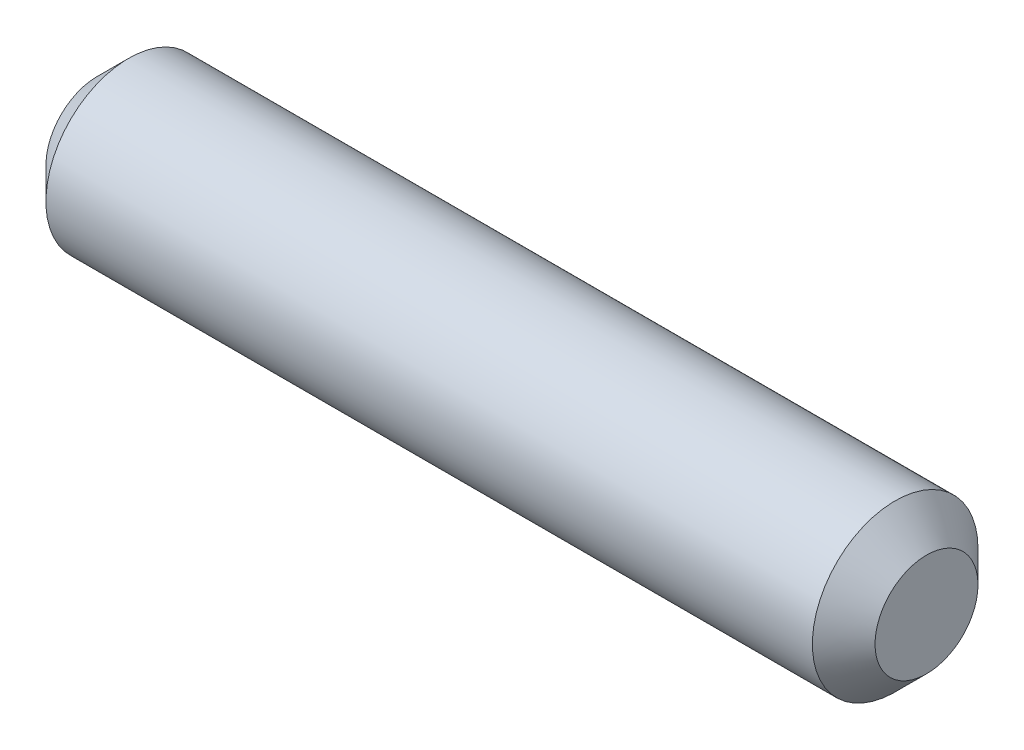
ISO-10303-21;
HEADER;
FILE_DESCRIPTION(('STEP AP214'),'2;1');
FILE_NAME('part.step','',(''),(''),'','','');
FILE_SCHEMA(('AUTOMOTIVE_DESIGN { 1 0 10303 214 1 1 1 1 }'));
ENDSEC;
DATA;
#1=APPLICATION_CONTEXT('core data for automotive mechanical design processes');
#2=APPLICATION_PROTOCOL_DEFINITION('international standard','automotive_design',2000,#1);
#3=PRODUCT_CONTEXT('',#1,'mechanical');
#4=PRODUCT('Part','Part','',(#3));
#5=PRODUCT_RELATED_PRODUCT_CATEGORY('part','',(#4));
#6=PRODUCT_DEFINITION_FORMATION('','',#4);
#7=PRODUCT_DEFINITION_CONTEXT('part definition',#1,'design');
#8=PRODUCT_DEFINITION('design','',#6,#7);
#9=PRODUCT_DEFINITION_SHAPE('','',#8);
#10=(LENGTH_UNIT() NAMED_UNIT(*) SI_UNIT(.MILLI.,.METRE.));
#11=(NAMED_UNIT(*) PLANE_ANGLE_UNIT() SI_UNIT($,.RADIAN.));
#12=(NAMED_UNIT(*) SI_UNIT($,.STERADIAN.) SOLID_ANGLE_UNIT());
#13=UNCERTAINTY_MEASURE_WITH_UNIT(LENGTH_MEASURE(1.E-05),#10,'distance_accuracy_value','');
#14=(GEOMETRIC_REPRESENTATION_CONTEXT(3) GLOBAL_UNCERTAINTY_ASSIGNED_CONTEXT((#13)) GLOBAL_UNIT_ASSIGNED_CONTEXT((#10,
#11,#12)) REPRESENTATION_CONTEXT('',''));
#15=CARTESIAN_POINT('',(0.,0.,0.));
#16=DIRECTION('',(0.,0.,1.));
#17=DIRECTION('',(1.,0.,0.));
#18=AXIS2_PLACEMENT_3D('',#15,#16,#17);
#19=CARTESIAN_POINT('',(7.935,0.,0.));
#20=DIRECTION('',(-1.,0.,0.));
#21=DIRECTION('',(0.,0.,1.));
#22=AXIS2_PLACEMENT_3D('',#19,#20,#21);
#23=CYLINDRICAL_SURFACE('',#22,1.585);
#24=CARTESIAN_POINT('',(-7.335,0.,0.));
#25=DIRECTION('',(1.,0.,0.));
#26=DIRECTION('',(0.,0.,-1.));
#27=AXIS2_PLACEMENT_3D('',#24,#25,#26);
#28=CIRCLE('',#27,1.585);
#29=CARTESIAN_POINT('',(-7.335,0.,-1.585));
#30=VERTEX_POINT('',#29);
#31=EDGE_CURVE('E45',#30,#30,#28,.T.);
#32=ORIENTED_EDGE('',*,*,#31,.T.);
#33=EDGE_LOOP('',(#32));
#34=FACE_BOUND('',#33,.T.);
#35=CARTESIAN_POINT('',(7.335,0.,0.));
#36=DIRECTION('',(1.,0.,0.));
#37=DIRECTION('',(0.,0.,-1.));
#38=AXIS2_PLACEMENT_3D('',#35,#36,#37);
#39=CIRCLE('',#38,1.585);
#40=CARTESIAN_POINT('',(7.335,0.,-1.585));
#41=VERTEX_POINT('',#40);
#42=EDGE_CURVE('E49',#41,#41,#39,.F.);
#43=ORIENTED_EDGE('',*,*,#42,.T.);
#44=EDGE_LOOP('',(#43));
#45=FACE_BOUND('',#44,.T.);
#46=ADVANCED_FACE('F33',(#34,#45),#23,.T.);
#47=CARTESIAN_POINT('',(7.935,0.,0.));
#48=DIRECTION('',(1.,0.,0.));
#49=DIRECTION('',(0.,0.,-1.));
#50=AXIS2_PLACEMENT_3D('',#47,#48,#49);
#51=PLANE('',#50);
#52=CARTESIAN_POINT('',(7.935,0.,0.));
#53=DIRECTION('',(1.,0.,0.));
#54=DIRECTION('',(0.,0.,-1.));
#55=AXIS2_PLACEMENT_3D('',#52,#53,#54);
#56=CIRCLE('',#55,0.984999999999998);
#57=CARTESIAN_POINT('',(7.935,0.,-0.984999999999998));
#58=VERTEX_POINT('',#57);
#59=EDGE_CURVE('E10',#58,#58,#56,.T.);
#60=ORIENTED_EDGE('',*,*,#59,.T.);
#61=EDGE_LOOP('',(#60));
#62=FACE_BOUND('',#61,.T.);
#63=ADVANCED_FACE('F65',(#62),#51,.T.);
#64=CARTESIAN_POINT('',(-7.935,0.,0.));
#65=DIRECTION('',(1.,0.,0.));
#66=DIRECTION('',(0.,0.,-1.));
#67=AXIS2_PLACEMENT_3D('',#64,#65,#66);
#68=PLANE('',#67);
#69=CARTESIAN_POINT('',(-7.935,0.,0.));
#70=DIRECTION('',(1.,0.,0.));
#71=DIRECTION('',(0.,0.,-1.));
#72=AXIS2_PLACEMENT_3D('',#69,#70,#71);
#73=CIRCLE('',#72,0.984999999999998);
#74=CARTESIAN_POINT('',(-7.935,0.,-0.984999999999997));
#75=VERTEX_POINT('',#74);
#76=EDGE_CURVE('E41',#75,#75,#73,.F.);
#77=ORIENTED_EDGE('',*,*,#76,.T.);
#78=EDGE_LOOP('',(#77));
#79=FACE_BOUND('',#78,.T.);
#80=ADVANCED_FACE('F62',(#79),#68,.F.);
#81=CARTESIAN_POINT('',(-7.335,0.,0.));
#82=DIRECTION('',(1.,0.,0.));
#83=DIRECTION('',(0.,0.,-1.));
#84=AXIS2_PLACEMENT_3D('',#81,#82,#83);
#85=CONICAL_SURFACE('',#84,1.585,0.785398163397449);
#86=CARTESIAN_POINT('',(-7.935,0.,-0.984999999999997));
#87=CARTESIAN_POINT('',(-7.92875,0.,-0.991249999999997));
#88=CARTESIAN_POINT('',(-7.9225,0.,-0.997499999999997));
#89=CARTESIAN_POINT('',(-7.91,0.,-1.01));
#90=CARTESIAN_POINT('',(-7.90375,0.,-1.01625));
#91=CARTESIAN_POINT('',(-7.89125,0.,-1.02875));
#92=CARTESIAN_POINT('',(-7.885,0.,-1.035));
#93=CARTESIAN_POINT('',(-7.8725,0.,-1.0475));
#94=CARTESIAN_POINT('',(-7.86625,0.,-1.05375));
#95=CARTESIAN_POINT('',(-7.85375,0.,-1.06625));
#96=CARTESIAN_POINT('',(-7.8475,0.,-1.0725));
#97=CARTESIAN_POINT('',(-7.835,0.,-1.085));
#98=CARTESIAN_POINT('',(-7.82875,0.,-1.09125));
#99=CARTESIAN_POINT('',(-7.81625,0.,-1.10375));
#100=CARTESIAN_POINT('',(-7.81,0.,-1.11));
#101=CARTESIAN_POINT('',(-7.7975,0.,-1.1225));
#102=CARTESIAN_POINT('',(-7.79125,0.,-1.12875));
#103=CARTESIAN_POINT('',(-7.77875,0.,-1.14125));
#104=CARTESIAN_POINT('',(-7.7725,0.,-1.1475));
#105=CARTESIAN_POINT('',(-7.76,0.,-1.16));
#106=CARTESIAN_POINT('',(-7.75375,0.,-1.16625));
#107=CARTESIAN_POINT('',(-7.74125,0.,-1.17875));
#108=CARTESIAN_POINT('',(-7.735,0.,-1.185));
#109=CARTESIAN_POINT('',(-7.7225,0.,-1.1975));
#110=CARTESIAN_POINT('',(-7.71625,0.,-1.20375));
#111=CARTESIAN_POINT('',(-7.70375,0.,-1.21625));
#112=CARTESIAN_POINT('',(-7.6975,0.,-1.2225));
#113=CARTESIAN_POINT('',(-7.685,0.,-1.235));
#114=CARTESIAN_POINT('',(-7.67875,0.,-1.24125));
#115=CARTESIAN_POINT('',(-7.66625,0.,-1.25375));
#116=CARTESIAN_POINT('',(-7.66,0.,-1.26));
#117=CARTESIAN_POINT('',(-7.6475,0.,-1.2725));
#118=CARTESIAN_POINT('',(-7.64125,0.,-1.27875));
#119=CARTESIAN_POINT('',(-7.62875,0.,-1.29125));
#120=CARTESIAN_POINT('',(-7.6225,0.,-1.2975));
#121=CARTESIAN_POINT('',(-7.61,0.,-1.31));
#122=CARTESIAN_POINT('',(-7.60375,0.,-1.31625));
#123=CARTESIAN_POINT('',(-7.59125,0.,-1.32875));
#124=CARTESIAN_POINT('',(-7.585,0.,-1.335));
#125=CARTESIAN_POINT('',(-7.5725,0.,-1.3475));
#126=CARTESIAN_POINT('',(-7.56625,0.,-1.35375));
#127=CARTESIAN_POINT('',(-7.55375,0.,-1.36625));
#128=CARTESIAN_POINT('',(-7.5475,0.,-1.3725));
#129=CARTESIAN_POINT('',(-7.535,0.,-1.385));
#130=CARTESIAN_POINT('',(-7.52875,0.,-1.39125));
#131=CARTESIAN_POINT('',(-7.51625,0.,-1.40375));
#132=CARTESIAN_POINT('',(-7.51,0.,-1.41));
#133=CARTESIAN_POINT('',(-7.4975,0.,-1.4225));
#134=CARTESIAN_POINT('',(-7.49125,0.,-1.42875));
#135=CARTESIAN_POINT('',(-7.47875,0.,-1.44125));
#136=CARTESIAN_POINT('',(-7.4725,0.,-1.4475));
#137=CARTESIAN_POINT('',(-7.46,0.,-1.46));
#138=CARTESIAN_POINT('',(-7.45375,0.,-1.46625));
#139=CARTESIAN_POINT('',(-7.44125,0.,-1.47875));
#140=CARTESIAN_POINT('',(-7.435,0.,-1.485));
#141=CARTESIAN_POINT('',(-7.4225,0.,-1.4975));
#142=CARTESIAN_POINT('',(-7.41625,0.,-1.50375));
#143=CARTESIAN_POINT('',(-7.40375,0.,-1.51625));
#144=CARTESIAN_POINT('',(-7.3975,0.,-1.5225));
#145=CARTESIAN_POINT('',(-7.385,0.,-1.535));
#146=CARTESIAN_POINT('',(-7.37875,0.,-1.54125));
#147=CARTESIAN_POINT('',(-7.36625,0.,-1.55375));
#148=CARTESIAN_POINT('',(-7.36,0.,-1.56));
#149=CARTESIAN_POINT('',(-7.3475,0.,-1.5725));
#150=CARTESIAN_POINT('',(-7.34125,0.,-1.57875));
#151=CARTESIAN_POINT('',(-7.335,0.,-1.585));
#152=B_SPLINE_CURVE_WITH_KNOTS('',3,(#86,#87,#88,#89,#90,#91,#92,#93,#94,#95,#96,#97,#98,#99,
#100,#101,#102,#103,#104,#105,#106,#107,#108,#109,#110,#111,#112,#113,#114,#115,#116,#117,#118,
#119,#120,#121,#122,#123,#124,#125,#126,#127,#128,#129,#130,#131,#132,#133,#134,#135,#136,#137,
#138,#139,#140,#141,#142,#143,#144,#145,#146,#147,#148,#149,#150,#151),.UNSPECIFIED.,.F.,.F.,(4,
2,2,2,2,2,2,2,2,2,2,2,2,2,2,2,2,2,2,2,2,2,2,2,2,2,2,2,2,2,2,2,4),(0.,0.0265165042944954,
0.0530330085889906,0.0795495128834861,0.106066017177981,0.132582521472478,0.159099025766973,
0.185615530061469,0.212132034355965,0.23864853865046,0.265165042944956,0.291681547239451,
0.318198051533947,0.344714555828443,0.371231060122938,0.397747564417434,0.424264068711929,
0.450780573006425,0.477297077300921,0.503813581595417,0.530330085889912,0.556846590184408,
0.583363094478903,0.609879598773399,0.636396103067895,0.66291260736239,0.689429111656886,
0.715945615951381,0.742462120245877,0.768978624540373,0.795495128834869,0.822011633129364,
0.84852813742386),.UNSPECIFIED.);
#153=EDGE_CURVE('BSEAM58',#75,#30,#152,.T.);
#154=ORIENTED_EDGE('',*,*,#76,.F.);
#155=ORIENTED_EDGE('',*,*,#31,.F.);
#156=ORIENTED_EDGE('',*,*,#153,.T.);
#157=ORIENTED_EDGE('',*,*,#153,.F.);
#158=EDGE_LOOP('',(#154,#156,#155,#157));
#159=FACE_BOUND('',#158,.T.);
#160=ADVANCED_FACE('F58',(#159),#85,.T.);
#161=CARTESIAN_POINT('',(7.935,0.,0.));
#162=DIRECTION('',(-1.,0.,0.));
#163=DIRECTION('',(0.,0.,1.));
#164=AXIS2_PLACEMENT_3D('',#161,#162,#163);
#165=CONICAL_SURFACE('',#164,0.984999999999998,0.785398163397448);
#166=ORIENTED_EDGE('',*,*,#42,.F.);
#167=EDGE_LOOP('',(#166));
#168=FACE_BOUND('',#167,.T.);
#169=ORIENTED_EDGE('',*,*,#59,.F.);
#170=EDGE_LOOP('',(#169));
#171=FACE_BOUND('',#170,.T.);
#172=ADVANCED_FACE('F36',(#168,#171),#165,.T.);
#173=CLOSED_SHELL('',(#46,#63,#80,#160,#172));
#174=MANIFOLD_SOLID_BREP('B2',#173);
#175=ADVANCED_BREP_SHAPE_REPRESENTATION('',(#18,#174),#14);
#176=SHAPE_DEFINITION_REPRESENTATION(#9,#175);
ENDSEC;
END-ISO-10303-21;
